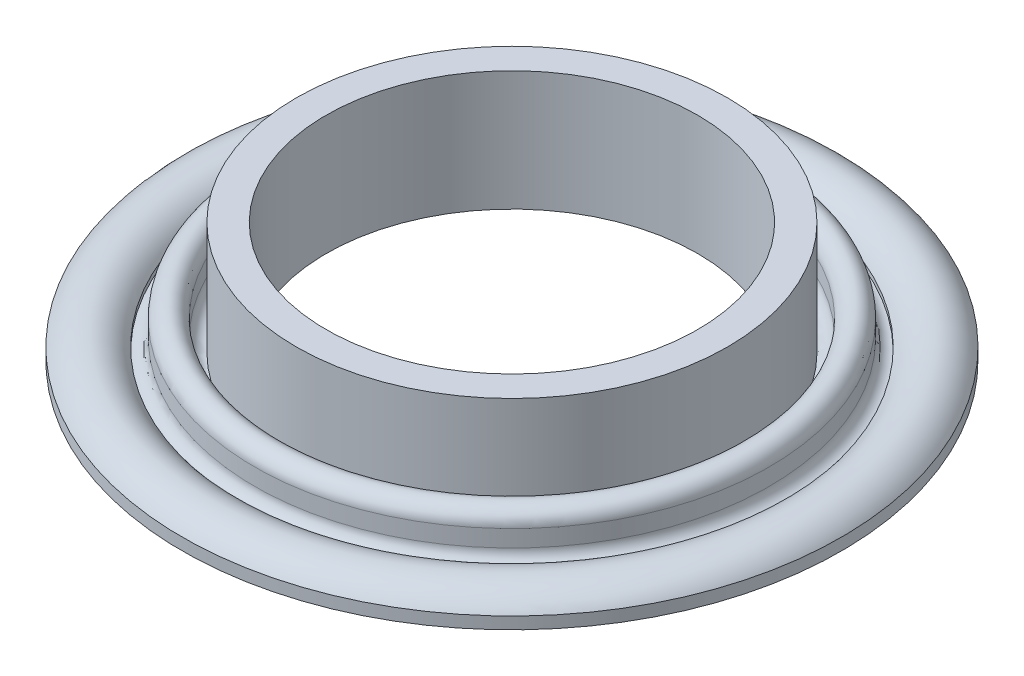
ISO-10303-21;
HEADER;
FILE_DESCRIPTION(('STEP AP214'),'2;1');
FILE_NAME('part.step','',(''),(''),'','','');
FILE_SCHEMA(('AUTOMOTIVE_DESIGN { 1 0 10303 214 1 1 1 1 }'));
ENDSEC;
DATA;
#1=APPLICATION_CONTEXT('core data for automotive mechanical design processes');
#2=APPLICATION_PROTOCOL_DEFINITION('international standard','automotive_design',2000,#1);
#3=PRODUCT_CONTEXT('',#1,'mechanical');
#4=PRODUCT('Part','Part','',(#3));
#5=PRODUCT_RELATED_PRODUCT_CATEGORY('part','',(#4));
#6=PRODUCT_DEFINITION_FORMATION('','',#4);
#7=PRODUCT_DEFINITION_CONTEXT('part definition',#1,'design');
#8=PRODUCT_DEFINITION('design','',#6,#7);
#9=PRODUCT_DEFINITION_SHAPE('','',#8);
#10=(LENGTH_UNIT() NAMED_UNIT(*) SI_UNIT(.MILLI.,.METRE.));
#11=(NAMED_UNIT(*) PLANE_ANGLE_UNIT() SI_UNIT($,.RADIAN.));
#12=(NAMED_UNIT(*) SI_UNIT($,.STERADIAN.) SOLID_ANGLE_UNIT());
#13=UNCERTAINTY_MEASURE_WITH_UNIT(LENGTH_MEASURE(1.E-05),#10,'distance_accuracy_value','');
#14=(GEOMETRIC_REPRESENTATION_CONTEXT(3) GLOBAL_UNCERTAINTY_ASSIGNED_CONTEXT((#13)) GLOBAL_UNIT_ASSIGNED_CONTEXT((#10,
#11,#12)) REPRESENTATION_CONTEXT('',''));
#15=CARTESIAN_POINT('',(0.,0.,0.));
#16=DIRECTION('',(0.,0.,1.));
#17=DIRECTION('',(1.,0.,0.));
#18=AXIS2_PLACEMENT_3D('',#15,#16,#17);
#19=CARTESIAN_POINT('',(0.,4.16904364733251,0.));
#20=DIRECTION('',(0.,-1.,0.));
#21=DIRECTION('',(0.,0.,-1.));
#22=AXIS2_PLACEMENT_3D('',#19,#20,#21);
#23=TOROIDAL_SURFACE('',#22,57.15,4.16904364733251);
#24=CARTESIAN_POINT('',(0.,0.,0.));
#25=DIRECTION('',(0.,-1.,0.));
#26=DIRECTION('',(0.,0.,-1.));
#27=AXIS2_PLACEMENT_3D('',#24,#25,#26);
#28=CIRCLE('',#27,57.15);
#29=CARTESIAN_POINT('',(0.,0.,-57.15));
#30=VERTEX_POINT('',#29);
#31=EDGE_CURVE('E92',#30,#30,#28,.T.);
#32=ORIENTED_EDGE('',*,*,#31,.T.);
#33=EDGE_LOOP('',(#32));
#34=FACE_BOUND('',#33,.T.);
#35=CARTESIAN_POINT('',(0.,4.1690436473325,0.));
#36=DIRECTION('',(0.,-1.,0.));
#37=DIRECTION('',(0.,0.,-1.));
#38=AXIS2_PLACEMENT_3D('',#35,#36,#37);
#39=CIRCLE('',#38,52.9809563526675);
#40=CARTESIAN_POINT('',(0.,4.1690436473325,-52.9809563526675));
#41=VERTEX_POINT('',#40);
#42=EDGE_CURVE('E10',#41,#41,#39,.T.);
#43=ORIENTED_EDGE('',*,*,#42,.F.);
#44=EDGE_LOOP('',(#43));
#45=FACE_BOUND('',#44,.T.);
#46=ADVANCED_FACE('F34',(#34,#45),#23,.T.);
#47=CARTESIAN_POINT('',(0.,0.,0.));
#48=DIRECTION('',(0.,-1.,0.));
#49=DIRECTION('',(0.,0.,-1.));
#50=AXIS2_PLACEMENT_3D('',#47,#48,#49);
#51=CYLINDRICAL_SURFACE('',#50,52.9809563526675);
#52=ORIENTED_EDGE('',*,*,#42,.T.);
#53=EDGE_LOOP('',(#52));
#54=FACE_BOUND('',#53,.T.);
#55=CARTESIAN_POINT('',(0.,7.73410761149609,0.));
#56=DIRECTION('',(0.,-1.,0.));
#57=DIRECTION('',(0.,0.,-1.));
#58=AXIS2_PLACEMENT_3D('',#55,#56,#57);
#59=CIRCLE('',#58,52.9809563526675);
#60=CARTESIAN_POINT('',(0.,7.73410761149609,-52.9809563526675));
#61=VERTEX_POINT('',#60);
#62=EDGE_CURVE('E40',#61,#61,#59,.T.);
#63=ORIENTED_EDGE('',*,*,#62,.F.);
#64=EDGE_LOOP('',(#63));
#65=FACE_BOUND('',#64,.T.);
#66=ADVANCED_FACE('F110',(#54,#65),#51,.F.);
#67=CARTESIAN_POINT('',(0.,7.73410761149609,0.));
#68=DIRECTION('',(0.,-1.,0.));
#69=DIRECTION('',(0.,0.,-1.));
#70=AXIS2_PLACEMENT_3D('',#67,#68,#69);
#71=TOROIDAL_SURFACE('',#70,51.435,1.5459563526675);
#72=ORIENTED_EDGE('',*,*,#62,.T.);
#73=EDGE_LOOP('',(#72));
#74=FACE_BOUND('',#73,.T.);
#75=CARTESIAN_POINT('',(0.,7.73410761149609,0.));
#76=DIRECTION('',(0.,-1.,0.));
#77=DIRECTION('',(0.,0.,-1.));
#78=AXIS2_PLACEMENT_3D('',#75,#76,#77);
#79=CIRCLE('',#78,49.8890436473325);
#80=CARTESIAN_POINT('',(0.,7.73410761149609,-49.8890436473325));
#81=VERTEX_POINT('',#80);
#82=EDGE_CURVE('E44',#81,#81,#79,.T.);
#83=ORIENTED_EDGE('',*,*,#82,.F.);
#84=EDGE_LOOP('',(#83));
#85=FACE_BOUND('',#84,.T.);
#86=ADVANCED_FACE('F114',(#74,#85),#71,.F.);
#87=CARTESIAN_POINT('',(0.,0.,0.));
#88=DIRECTION('',(0.,-1.,0.));
#89=DIRECTION('',(0.,0.,-1.));
#90=AXIS2_PLACEMENT_3D('',#87,#88,#89);
#91=CYLINDRICAL_SURFACE('',#90,49.8890436473325);
#92=ORIENTED_EDGE('',*,*,#82,.T.);
#93=EDGE_LOOP('',(#92));
#94=FACE_BOUND('',#93,.T.);
#95=CARTESIAN_POINT('',(0.,4.16904364733251,0.));
#96=DIRECTION('',(0.,-1.,0.));
#97=DIRECTION('',(0.,0.,-1.));
#98=AXIS2_PLACEMENT_3D('',#95,#96,#97);
#99=CIRCLE('',#98,49.8890436473325);
#100=CARTESIAN_POINT('',(0.,4.16904364733251,-49.8890436473325));
#101=VERTEX_POINT('',#100);
#102=EDGE_CURVE('E48',#101,#101,#99,.T.);
#103=ORIENTED_EDGE('',*,*,#102,.F.);
#104=EDGE_LOOP('',(#103));
#105=FACE_BOUND('',#104,.T.);
#106=ADVANCED_FACE('F118',(#94,#105),#91,.T.);
#107=CARTESIAN_POINT('',(0.,4.16904364733251,0.));
#108=DIRECTION('',(0.,-1.,0.));
#109=DIRECTION('',(0.,0.,-1.));
#110=AXIS2_PLACEMENT_3D('',#107,#108,#109);
#111=TOROIDAL_SURFACE('',#110,45.72,4.16904364733251);
#112=ORIENTED_EDGE('',*,*,#102,.T.);
#113=EDGE_LOOP('',(#112));
#114=FACE_BOUND('',#113,.T.);
#115=CARTESIAN_POINT('',(0.,0.,0.));
#116=DIRECTION('',(0.,-1.,0.));
#117=DIRECTION('',(0.,0.,-1.));
#118=AXIS2_PLACEMENT_3D('',#115,#116,#117);
#119=CIRCLE('',#118,45.72);
#120=CARTESIAN_POINT('',(0.,0.,-45.72));
#121=VERTEX_POINT('',#120);
#122=EDGE_CURVE('E53',#121,#121,#119,.T.);
#123=ORIENTED_EDGE('',*,*,#122,.F.);
#124=EDGE_LOOP('',(#123));
#125=FACE_BOUND('',#124,.T.);
#126=ADVANCED_FACE('F124',(#114,#125),#111,.T.);
#127=CARTESIAN_POINT('',(45.72,0.,0.));
#128=DIRECTION('',(0.,-1.,0.));
#129=DIRECTION('',(0.,0.,-1.));
#130=AXIS2_PLACEMENT_3D('',#127,#128,#129);
#131=PLANE('',#130);
#132=ORIENTED_EDGE('',*,*,#122,.T.);
#133=EDGE_LOOP('',(#132));
#134=FACE_BOUND('',#133,.T.);
#135=CARTESIAN_POINT('',(0.,0.,0.));
#136=DIRECTION('',(0.,-1.,0.));
#137=DIRECTION('',(0.,0.,-1.));
#138=AXIS2_PLACEMENT_3D('',#135,#136,#137);
#139=CIRCLE('',#138,39.37);
#140=CARTESIAN_POINT('',(0.,0.,-39.37));
#141=VERTEX_POINT('',#140);
#142=EDGE_CURVE('E56',#141,#141,#139,.T.);
#143=ORIENTED_EDGE('',*,*,#142,.F.);
#144=EDGE_LOOP('',(#143));
#145=FACE_BOUND('',#144,.T.);
#146=ADVANCED_FACE('F128',(#134,#145),#131,.T.);
#147=CARTESIAN_POINT('',(0.,0.,0.));
#148=DIRECTION('',(0.,-1.,0.));
#149=DIRECTION('',(0.,0.,-1.));
#150=AXIS2_PLACEMENT_3D('',#147,#148,#149);
#151=CYLINDRICAL_SURFACE('',#150,39.37);
#152=ORIENTED_EDGE('',*,*,#142,.T.);
#153=EDGE_LOOP('',(#152));
#154=FACE_BOUND('',#153,.T.);
#155=CARTESIAN_POINT('',(0.,25.4,0.));
#156=DIRECTION('',(0.,-1.,0.));
#157=DIRECTION('',(0.,0.,-1.));
#158=AXIS2_PLACEMENT_3D('',#155,#156,#157);
#159=CIRCLE('',#158,39.37);
#160=CARTESIAN_POINT('',(0.,25.4,-39.37));
#161=VERTEX_POINT('',#160);
#162=EDGE_CURVE('E59',#161,#161,#159,.T.);
#163=ORIENTED_EDGE('',*,*,#162,.F.);
#164=EDGE_LOOP('',(#163));
#165=FACE_BOUND('',#164,.T.);
#166=ADVANCED_FACE('F132',(#154,#165),#151,.F.);
#167=CARTESIAN_POINT('',(39.37,25.4,0.));
#168=DIRECTION('',(0.,1.,0.));
#169=DIRECTION('',(0.,0.,1.));
#170=AXIS2_PLACEMENT_3D('',#167,#168,#169);
#171=PLANE('',#170);
#172=ORIENTED_EDGE('',*,*,#162,.T.);
#173=EDGE_LOOP('',(#172));
#174=FACE_BOUND('',#173,.T.);
#175=CARTESIAN_POINT('',(0.,25.4,0.));
#176=DIRECTION('',(0.,-1.,0.));
#177=DIRECTION('',(0.,0.,-1.));
#178=AXIS2_PLACEMENT_3D('',#175,#176,#177);
#179=CIRCLE('',#178,45.72);
#180=CARTESIAN_POINT('',(0.,25.4,-45.72));
#181=VERTEX_POINT('',#180);
#182=EDGE_CURVE('E62',#181,#181,#179,.T.);
#183=ORIENTED_EDGE('',*,*,#182,.F.);
#184=EDGE_LOOP('',(#183));
#185=FACE_BOUND('',#184,.T.);
#186=ADVANCED_FACE('F136',(#174,#185),#171,.T.);
#187=CARTESIAN_POINT('',(0.,0.,0.));
#188=DIRECTION('',(0.,-1.,0.));
#189=DIRECTION('',(0.,0.,-1.));
#190=AXIS2_PLACEMENT_3D('',#187,#188,#189);
#191=CYLINDRICAL_SURFACE('',#190,45.72);
#192=ORIENTED_EDGE('',*,*,#182,.T.);
#193=EDGE_LOOP('',(#192));
#194=FACE_BOUND('',#193,.T.);
#195=CARTESIAN_POINT('',(0.,1.524,0.));
#196=DIRECTION('',(0.,-1.,0.));
#197=DIRECTION('',(0.,0.,-1.));
#198=AXIS2_PLACEMENT_3D('',#195,#196,#197);
#199=CIRCLE('',#198,45.72);
#200=CARTESIAN_POINT('',(0.,1.524,-45.72));
#201=VERTEX_POINT('',#200);
#202=EDGE_CURVE('E65',#201,#201,#199,.T.);
#203=ORIENTED_EDGE('',*,*,#202,.F.);
#204=EDGE_LOOP('',(#203));
#205=FACE_BOUND('',#204,.T.);
#206=ADVANCED_FACE('F140',(#194,#205),#191,.T.);
#207=CARTESIAN_POINT('',(0.,4.16904364733251,0.));
#208=DIRECTION('',(0.,-1.,0.));
#209=DIRECTION('',(0.,0.,-1.));
#210=AXIS2_PLACEMENT_3D('',#207,#208,#209);
#211=TOROIDAL_SURFACE('',#210,45.72,2.64504364733251);
#212=ORIENTED_EDGE('',*,*,#202,.T.);
#213=EDGE_LOOP('',(#212));
#214=FACE_BOUND('',#213,.T.);
#215=CARTESIAN_POINT('',(0.,4.16904364733251,0.));
#216=DIRECTION('',(0.,-1.,0.));
#217=DIRECTION('',(0.,0.,-1.));
#218=AXIS2_PLACEMENT_3D('',#215,#216,#217);
#219=CIRCLE('',#218,48.3650436473325);
#220=CARTESIAN_POINT('',(0.,4.16904364733251,-48.3650436473325));
#221=VERTEX_POINT('',#220);
#222=EDGE_CURVE('E68',#221,#221,#219,.T.);
#223=ORIENTED_EDGE('',*,*,#222,.F.);
#224=EDGE_LOOP('',(#223));
#225=FACE_BOUND('',#224,.T.);
#226=ADVANCED_FACE('F144',(#214,#225),#211,.F.);
#227=CARTESIAN_POINT('',(0.,0.,0.));
#228=DIRECTION('',(0.,-1.,0.));
#229=DIRECTION('',(0.,0.,-1.));
#230=AXIS2_PLACEMENT_3D('',#227,#228,#229);
#231=CYLINDRICAL_SURFACE('',#230,48.3650436473325);
#232=ORIENTED_EDGE('',*,*,#222,.T.);
#233=EDGE_LOOP('',(#232));
#234=FACE_BOUND('',#233,.T.);
#235=CARTESIAN_POINT('',(0.,7.73410761149609,0.));
#236=DIRECTION('',(0.,-1.,0.));
#237=DIRECTION('',(0.,0.,-1.));
#238=AXIS2_PLACEMENT_3D('',#235,#236,#237);
#239=CIRCLE('',#238,48.3650436473325);
#240=CARTESIAN_POINT('',(0.,7.73410761149609,-48.3650436473325));
#241=VERTEX_POINT('',#240);
#242=EDGE_CURVE('E71',#241,#241,#239,.T.);
#243=ORIENTED_EDGE('',*,*,#242,.F.);
#244=EDGE_LOOP('',(#243));
#245=FACE_BOUND('',#244,.T.);
#246=ADVANCED_FACE('F148',(#234,#245),#231,.F.);
#247=CARTESIAN_POINT('',(0.,7.73410761149609,0.));
#248=DIRECTION('',(0.,-1.,0.));
#249=DIRECTION('',(0.,0.,-1.));
#250=AXIS2_PLACEMENT_3D('',#247,#248,#249);
#251=TOROIDAL_SURFACE('',#250,51.435,3.06995635266749);
#252=ORIENTED_EDGE('',*,*,#242,.T.);
#253=EDGE_LOOP('',(#252));
#254=FACE_BOUND('',#253,.T.);
#255=CARTESIAN_POINT('',(0.,7.73410761149609,0.));
#256=DIRECTION('',(0.,-1.,0.));
#257=DIRECTION('',(0.,0.,-1.));
#258=AXIS2_PLACEMENT_3D('',#255,#256,#257);
#259=CIRCLE('',#258,54.5049563526675);
#260=CARTESIAN_POINT('',(0.,7.73410761149609,-54.5049563526675));
#261=VERTEX_POINT('',#260);
#262=EDGE_CURVE('E74',#261,#261,#259,.T.);
#263=ORIENTED_EDGE('',*,*,#262,.F.);
#264=EDGE_LOOP('',(#263));
#265=FACE_BOUND('',#264,.T.);
#266=ADVANCED_FACE('F152',(#254,#265),#251,.T.);
#267=CARTESIAN_POINT('',(0.,0.,0.));
#268=DIRECTION('',(0.,-1.,0.));
#269=DIRECTION('',(0.,0.,-1.));
#270=AXIS2_PLACEMENT_3D('',#267,#268,#269);
#271=CYLINDRICAL_SURFACE('',#270,54.5049563526675);
#272=ORIENTED_EDGE('',*,*,#262,.T.);
#273=EDGE_LOOP('',(#272));
#274=FACE_BOUND('',#273,.T.);
#275=CARTESIAN_POINT('',(0.,4.16904364733251,0.));
#276=DIRECTION('',(0.,-1.,0.));
#277=DIRECTION('',(0.,0.,-1.));
#278=AXIS2_PLACEMENT_3D('',#275,#276,#277);
#279=CIRCLE('',#278,54.5049563526675);
#280=CARTESIAN_POINT('',(0.,4.16904364733251,-54.5049563526675));
#281=VERTEX_POINT('',#280);
#282=EDGE_CURVE('E77',#281,#281,#279,.T.);
#283=ORIENTED_EDGE('',*,*,#282,.F.);
#284=EDGE_LOOP('',(#283));
#285=FACE_BOUND('',#284,.T.);
#286=ADVANCED_FACE('F156',(#274,#285),#271,.T.);
#287=CARTESIAN_POINT('',(0.,4.16904364733251,0.));
#288=DIRECTION('',(0.,-1.,0.));
#289=DIRECTION('',(0.,0.,-1.));
#290=AXIS2_PLACEMENT_3D('',#287,#288,#289);
#291=TOROIDAL_SURFACE('',#290,57.15,2.64504364733251);
#292=ORIENTED_EDGE('',*,*,#282,.T.);
#293=EDGE_LOOP('',(#292));
#294=FACE_BOUND('',#293,.T.);
#295=CARTESIAN_POINT('',(0.,1.524,0.));
#296=DIRECTION('',(0.,-1.,0.));
#297=DIRECTION('',(0.,0.,-1.));
#298=AXIS2_PLACEMENT_3D('',#295,#296,#297);
#299=CIRCLE('',#298,57.15);
#300=CARTESIAN_POINT('',(0.,1.524,-57.15));
#301=VERTEX_POINT('',#300);
#302=EDGE_CURVE('E80',#301,#301,#299,.T.);
#303=ORIENTED_EDGE('',*,*,#302,.F.);
#304=EDGE_LOOP('',(#303));
#305=FACE_BOUND('',#304,.T.);
#306=ADVANCED_FACE('F160',(#294,#305),#291,.F.);
#307=CARTESIAN_POINT('',(0.,0.,0.));
#308=DIRECTION('',(0.,-1.,0.));
#309=DIRECTION('',(0.,0.,-1.));
#310=AXIS2_PLACEMENT_3D('',#307,#308,#309);
#311=CYLINDRICAL_SURFACE('',#310,57.15);
#312=ORIENTED_EDGE('',*,*,#302,.T.);
#313=EDGE_LOOP('',(#312));
#314=FACE_BOUND('',#313,.T.);
#315=CARTESIAN_POINT('',(0.,2.54,0.));
#316=DIRECTION('',(0.,-1.,0.));
#317=DIRECTION('',(0.,0.,-1.));
#318=AXIS2_PLACEMENT_3D('',#315,#316,#317);
#319=CIRCLE('',#318,57.15);
#320=CARTESIAN_POINT('',(0.,2.54,-57.15));
#321=VERTEX_POINT('',#320);
#322=EDGE_CURVE('E83',#321,#321,#319,.T.);
#323=ORIENTED_EDGE('',*,*,#322,.F.);
#324=EDGE_LOOP('',(#323));
#325=FACE_BOUND('',#324,.T.);
#326=ADVANCED_FACE('F164',(#314,#325),#311,.F.);
#327=CARTESIAN_POINT('',(0.,-1.67211348375134,0.));
#328=DIRECTION('',(0.,-1.,0.));
#329=DIRECTION('',(0.,0.,-1.));
#330=AXIS2_PLACEMENT_3D('',#327,#328,#329);
#331=TOROIDAL_SURFACE('',#330,63.5,7.62);
#332=ORIENTED_EDGE('',*,*,#322,.T.);
#333=EDGE_LOOP('',(#332));
#334=FACE_BOUND('',#333,.T.);
#335=CARTESIAN_POINT('',(0.,2.54,0.));
#336=DIRECTION('',(0.,-1.,0.));
#337=DIRECTION('',(0.,0.,-1.));
#338=AXIS2_PLACEMENT_3D('',#335,#336,#337);
#339=CIRCLE('',#338,69.85);
#340=CARTESIAN_POINT('',(0.,2.54,-69.85));
#341=VERTEX_POINT('',#340);
#342=EDGE_CURVE('E86',#341,#341,#339,.T.);
#343=ORIENTED_EDGE('',*,*,#342,.F.);
#344=EDGE_LOOP('',(#343));
#345=FACE_BOUND('',#344,.T.);
#346=ADVANCED_FACE('F106',(#334,#345),#331,.T.);
#347=CARTESIAN_POINT('',(0.,0.,0.));
#348=DIRECTION('',(0.,-1.,0.));
#349=DIRECTION('',(0.,0.,-1.));
#350=AXIS2_PLACEMENT_3D('',#347,#348,#349);
#351=CYLINDRICAL_SURFACE('',#350,69.85);
#352=ORIENTED_EDGE('',*,*,#342,.T.);
#353=EDGE_LOOP('',(#352));
#354=FACE_BOUND('',#353,.T.);
#355=CARTESIAN_POINT('',(0.,0.,0.));
#356=DIRECTION('',(0.,-1.,0.));
#357=DIRECTION('',(0.,0.,-1.));
#358=AXIS2_PLACEMENT_3D('',#355,#356,#357);
#359=CIRCLE('',#358,69.85);
#360=CARTESIAN_POINT('',(0.,0.,-69.85));
#361=VERTEX_POINT('',#360);
#362=EDGE_CURVE('E89',#361,#361,#359,.T.);
#363=ORIENTED_EDGE('',*,*,#362,.F.);
#364=EDGE_LOOP('',(#363));
#365=FACE_BOUND('',#364,.T.);
#366=ADVANCED_FACE('F100',(#354,#365),#351,.T.);
#367=CARTESIAN_POINT('',(57.15,0.,0.));
#368=DIRECTION('',(0.,-1.,0.));
#369=DIRECTION('',(0.,0.,-1.));
#370=AXIS2_PLACEMENT_3D('',#367,#368,#369);
#371=PLANE('',#370);
#372=ORIENTED_EDGE('',*,*,#362,.T.);
#373=EDGE_LOOP('',(#372));
#374=FACE_BOUND('',#373,.T.);
#375=ORIENTED_EDGE('',*,*,#31,.F.);
#376=EDGE_LOOP('',(#375));
#377=FACE_BOUND('',#376,.T.);
#378=ADVANCED_FACE('F98',(#374,#377),#371,.T.);
#379=CLOSED_SHELL('',(#46,#66,#86,#106,#126,#146,#166,#186,#206,#226,#246,#266,#286,#306,#326,
#346,#366,#378));
#380=MANIFOLD_SOLID_BREP('B2',#379);
#381=ADVANCED_BREP_SHAPE_REPRESENTATION('',(#18,#380),#14);
#382=SHAPE_DEFINITION_REPRESENTATION(#9,#381);
ENDSEC;
END-ISO-10303-21;
